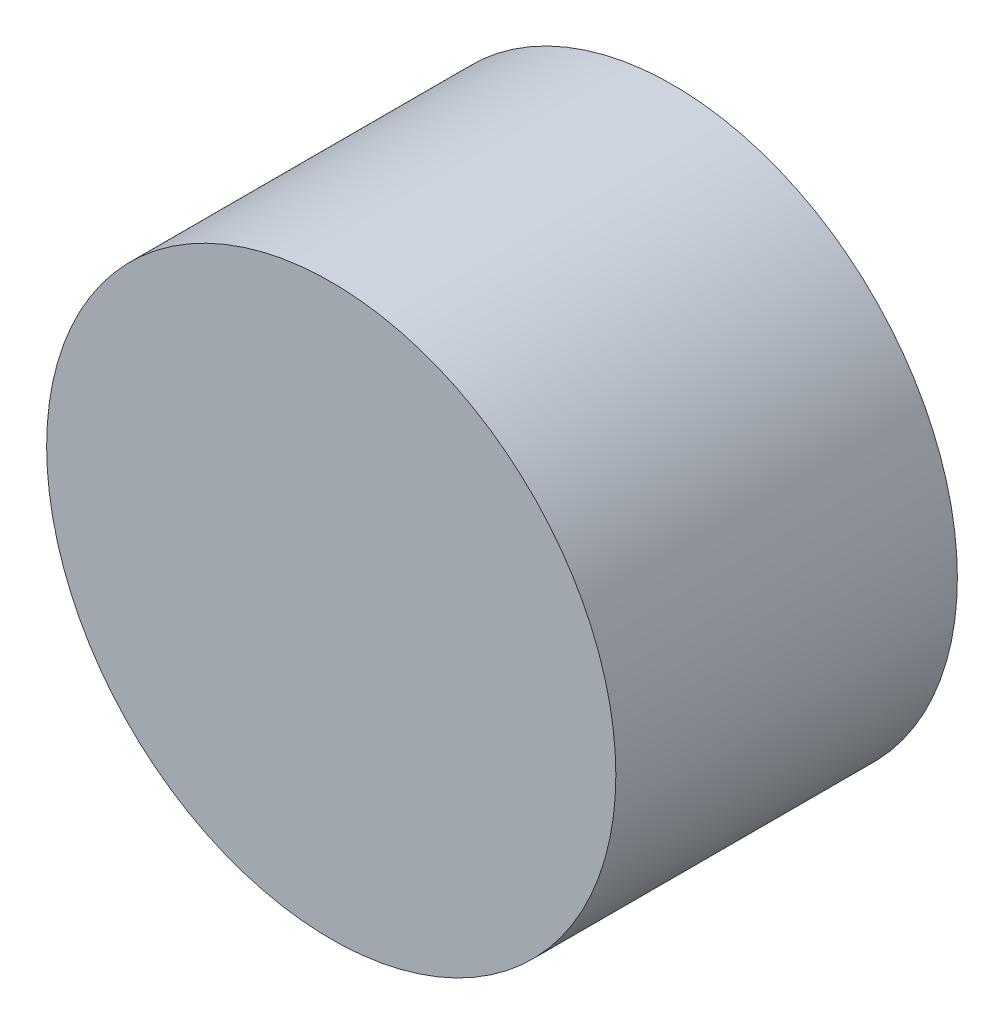
ISO-10303-21;
HEADER;
FILE_DESCRIPTION(('STEP AP214'),'2;1');
FILE_NAME('part.step','',(''),(''),'','','');
FILE_SCHEMA(('AUTOMOTIVE_DESIGN { 1 0 10303 214 1 1 1 1 }'));
ENDSEC;
DATA;
#1=APPLICATION_CONTEXT('core data for automotive mechanical design processes');
#2=APPLICATION_PROTOCOL_DEFINITION('international standard','automotive_design',2000,#1);
#3=PRODUCT_CONTEXT('',#1,'mechanical');
#4=PRODUCT('Part','Part','',(#3));
#5=PRODUCT_RELATED_PRODUCT_CATEGORY('part','',(#4));
#6=PRODUCT_DEFINITION_FORMATION('','',#4);
#7=PRODUCT_DEFINITION_CONTEXT('part definition',#1,'design');
#8=PRODUCT_DEFINITION('design','',#6,#7);
#9=PRODUCT_DEFINITION_SHAPE('','',#8);
#10=(LENGTH_UNIT() NAMED_UNIT(*) SI_UNIT(.MILLI.,.METRE.));
#11=(NAMED_UNIT(*) PLANE_ANGLE_UNIT() SI_UNIT($,.RADIAN.));
#12=(NAMED_UNIT(*) SI_UNIT($,.STERADIAN.) SOLID_ANGLE_UNIT());
#13=UNCERTAINTY_MEASURE_WITH_UNIT(LENGTH_MEASURE(1.E-05),#10,'distance_accuracy_value','');
#14=(GEOMETRIC_REPRESENTATION_CONTEXT(3) GLOBAL_UNCERTAINTY_ASSIGNED_CONTEXT((#13)) GLOBAL_UNIT_ASSIGNED_CONTEXT((#10,
#11,#12)) REPRESENTATION_CONTEXT('',''));
#15=CARTESIAN_POINT('',(0.,0.,0.));
#16=DIRECTION('',(0.,0.,1.));
#17=DIRECTION('',(1.,0.,0.));
#18=AXIS2_PLACEMENT_3D('',#15,#16,#17);
#19=CARTESIAN_POINT('',(0.,0.,60.));
#20=DIRECTION('',(0.,0.,-1.));
#21=DIRECTION('',(-1.,0.,0.));
#22=AXIS2_PLACEMENT_3D('',#19,#20,#21);
#23=CYLINDRICAL_SURFACE('',#22,50.);
#24=CARTESIAN_POINT('',(0.,0.,60.));
#25=DIRECTION('',(0.,0.,1.));
#26=DIRECTION('',(1.,0.,0.));
#27=AXIS2_PLACEMENT_3D('',#24,#25,#26);
#28=CIRCLE('',#27,50.);
#29=CARTESIAN_POINT('',(50.,0.,60.));
#30=VERTEX_POINT('',#29);
#31=EDGE_CURVE('E10',#30,#30,#28,.T.);
#32=ORIENTED_EDGE('',*,*,#31,.F.);
#33=EDGE_LOOP('',(#32));
#34=FACE_BOUND('',#33,.T.);
#35=CARTESIAN_POINT('',(0.,0.,0.));
#36=DIRECTION('',(0.,0.,1.));
#37=DIRECTION('',(1.,0.,0.));
#38=AXIS2_PLACEMENT_3D('',#35,#36,#37);
#39=CIRCLE('',#38,50.);
#40=CARTESIAN_POINT('',(50.,0.,0.));
#41=VERTEX_POINT('',#40);
#42=EDGE_CURVE('E37',#41,#41,#39,.T.);
#43=ORIENTED_EDGE('',*,*,#42,.T.);
#44=EDGE_LOOP('',(#43));
#45=FACE_BOUND('',#44,.T.);
#46=ADVANCED_FACE('F40',(#34,#45),#23,.T.);
#47=CARTESIAN_POINT('',(0.,0.,60.));
#48=DIRECTION('',(0.,0.,1.));
#49=DIRECTION('',(1.,0.,0.));
#50=AXIS2_PLACEMENT_3D('',#47,#48,#49);
#51=PLANE('',#50);
#52=ORIENTED_EDGE('',*,*,#31,.T.);
#53=EDGE_LOOP('',(#52));
#54=FACE_BOUND('',#53,.T.);
#55=ADVANCED_FACE('F55',(#54),#51,.T.);
#56=CARTESIAN_POINT('',(0.,0.,0.));
#57=DIRECTION('',(0.,0.,1.));
#58=DIRECTION('',(1.,0.,0.));
#59=AXIS2_PLACEMENT_3D('',#56,#57,#58);
#60=PLANE('',#59);
#61=ORIENTED_EDGE('',*,*,#42,.F.);
#62=EDGE_LOOP('',(#61));
#63=FACE_BOUND('',#62,.T.);
#64=ADVANCED_FACE('F49',(#63),#60,.F.);
#65=CLOSED_SHELL('',(#46,#55,#64));
#66=MANIFOLD_SOLID_BREP('B2',#65);
#67=ADVANCED_BREP_SHAPE_REPRESENTATION('',(#18,#66),#14);
#68=SHAPE_DEFINITION_REPRESENTATION(#9,#67);
ENDSEC;
END-ISO-10303-21;
